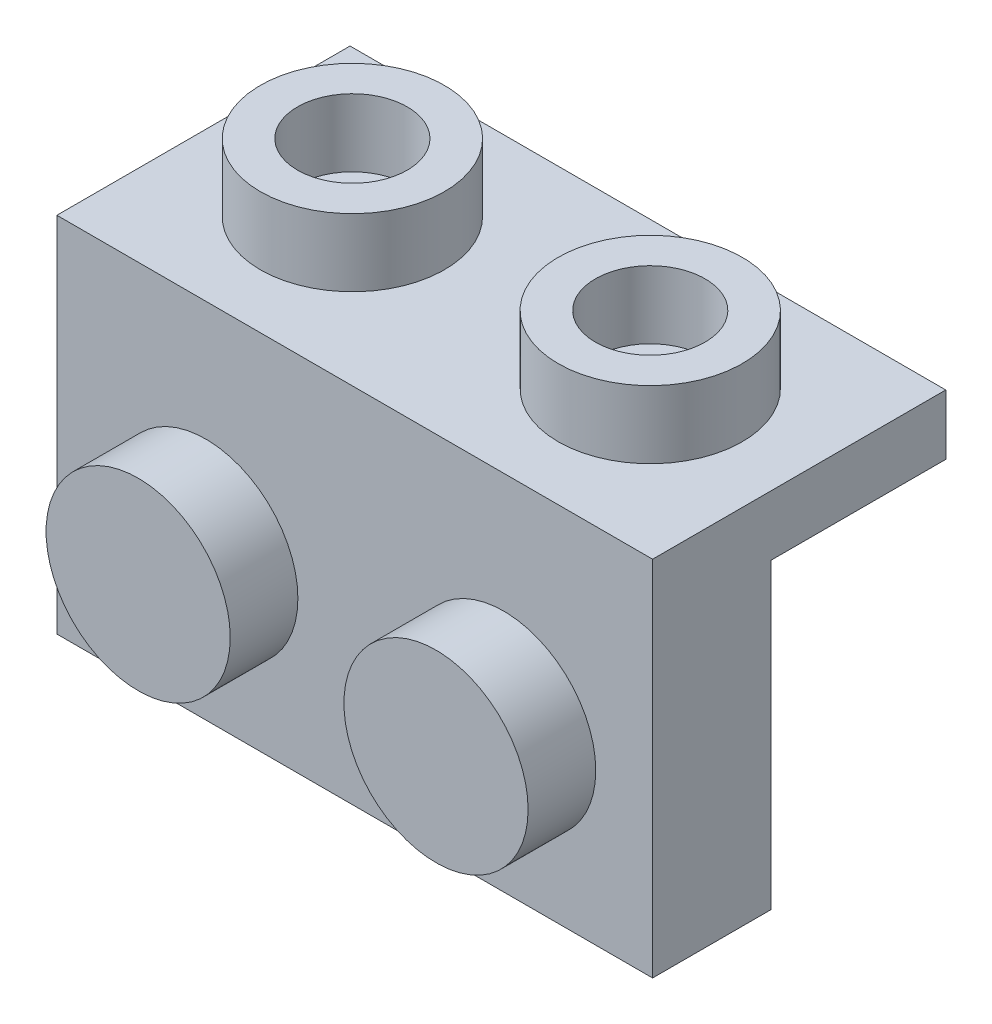
ISO-10303-21;
HEADER;
FILE_DESCRIPTION(('STEP AP214'),'2;1');
FILE_NAME('part.step','',(''),(''),'','','');
FILE_SCHEMA(('AUTOMOTIVE_DESIGN { 1 0 10303 214 1 1 1 1 }'));
ENDSEC;
DATA;
#1=APPLICATION_CONTEXT('core data for automotive mechanical design processes');
#2=APPLICATION_PROTOCOL_DEFINITION('international standard','automotive_design',2000,#1);
#3=PRODUCT_CONTEXT('',#1,'mechanical');
#4=PRODUCT('Part','Part','',(#3));
#5=PRODUCT_RELATED_PRODUCT_CATEGORY('part','',(#4));
#6=PRODUCT_DEFINITION_FORMATION('','',#4);
#7=PRODUCT_DEFINITION_CONTEXT('part definition',#1,'design');
#8=PRODUCT_DEFINITION('design','',#6,#7);
#9=PRODUCT_DEFINITION_SHAPE('','',#8);
#10=(LENGTH_UNIT() NAMED_UNIT(*) SI_UNIT(.MILLI.,.METRE.));
#11=(NAMED_UNIT(*) PLANE_ANGLE_UNIT() SI_UNIT($,.RADIAN.));
#12=(NAMED_UNIT(*) SI_UNIT($,.STERADIAN.) SOLID_ANGLE_UNIT());
#13=UNCERTAINTY_MEASURE_WITH_UNIT(LENGTH_MEASURE(1.E-05),#10,'distance_accuracy_value','');
#14=(GEOMETRIC_REPRESENTATION_CONTEXT(3) GLOBAL_UNCERTAINTY_ASSIGNED_CONTEXT((#13)) GLOBAL_UNIT_ASSIGNED_CONTEXT((#10,
#11,#12)) REPRESENTATION_CONTEXT('',''));
#15=CARTESIAN_POINT('',(0.,0.,0.));
#16=DIRECTION('',(0.,0.,1.));
#17=DIRECTION('',(1.,0.,0.));
#18=AXIS2_PLACEMENT_3D('',#15,#16,#17);
#19=CARTESIAN_POINT('',(-15.85,-9.65,-3.15));
#20=DIRECTION('',(0.,0.,-1.));
#21=DIRECTION('',(-1.,0.,0.));
#22=AXIS2_PLACEMENT_3D('',#19,#20,#21);
#23=PLANE('',#22);
#24=DIRECTION('',(1.,0.,0.));
#25=VECTOR('',#24,1.);
#26=CARTESIAN_POINT('',(-15.85,-8.15,-3.15));
#27=LINE('',#26,#25);
#28=CARTESIAN_POINT('',(-14.35,-8.15,-3.15));
#29=VERTEX_POINT('',#28);
#30=CARTESIAN_POINT('',(-1.5,-8.15,-3.15));
#31=VERTEX_POINT('',#30);
#32=EDGE_CURVE('E245',#29,#31,#27,.T.);
#33=ORIENTED_EDGE('',*,*,#32,.T.);
#34=DIRECTION('',(0.,1.,0.));
#35=VECTOR('',#34,1.);
#36=CARTESIAN_POINT('',(-1.5,0.,-3.15));
#37=LINE('',#36,#35);
#38=CARTESIAN_POINT('',(-1.5,-1.6,-3.15));
#39=VERTEX_POINT('',#38);
#40=EDGE_CURVE('E252',#31,#39,#37,.T.);
#41=ORIENTED_EDGE('',*,*,#40,.T.);
#42=DIRECTION('',(1.,0.,0.));
#43=VECTOR('',#42,1.);
#44=CARTESIAN_POINT('',(-15.85,-1.6,-3.15));
#45=LINE('',#44,#43);
#46=CARTESIAN_POINT('',(0.,-1.6,-3.15));
#47=VERTEX_POINT('',#46);
#48=EDGE_CURVE('E118',#39,#47,#45,.T.);
#49=ORIENTED_EDGE('',*,*,#48,.T.);
#50=DIRECTION('',(0.,1.,0.));
#51=VECTOR('',#50,1.);
#52=CARTESIAN_POINT('',(0.,-9.65,-3.15));
#53=LINE('',#52,#51);
#54=CARTESIAN_POINT('',(0.,-9.65,-3.15));
#55=VERTEX_POINT('',#54);
#56=EDGE_CURVE('E147',#55,#47,#53,.T.);
#57=ORIENTED_EDGE('',*,*,#56,.F.);
#58=DIRECTION('',(1.,0.,0.));
#59=VECTOR('',#58,1.);
#60=CARTESIAN_POINT('',(-15.85,-9.65,-3.15));
#61=LINE('',#60,#59);
#62=CARTESIAN_POINT('',(-15.85,-9.65,-3.15));
#63=VERTEX_POINT('',#62);
#64=EDGE_CURVE('E129',#63,#55,#61,.T.);
#65=ORIENTED_EDGE('',*,*,#64,.F.);
#66=DIRECTION('',(0.,1.,0.));
#67=VECTOR('',#66,1.);
#68=CARTESIAN_POINT('',(-15.85,-9.65,-3.15));
#69=LINE('',#68,#67);
#70=CARTESIAN_POINT('',(-15.85,-1.6,-3.15));
#71=VERTEX_POINT('',#70);
#72=EDGE_CURVE('E123',#63,#71,#69,.T.);
#73=ORIENTED_EDGE('',*,*,#72,.T.);
#74=CARTESIAN_POINT('',(-14.35,-1.6,-3.15));
#75=VERTEX_POINT('',#74);
#76=EDGE_CURVE('E104',#71,#75,#45,.T.);
#77=ORIENTED_EDGE('',*,*,#76,.T.);
#78=DIRECTION('',(0.,1.,0.));
#79=VECTOR('',#78,1.);
#80=CARTESIAN_POINT('',(-14.35,0.,-3.15));
#81=LINE('',#80,#79);
#82=EDGE_CURVE('E246',#29,#75,#81,.T.);
#83=ORIENTED_EDGE('',*,*,#82,.F.);
#84=EDGE_LOOP('',(#33,#41,#49,#57,#65,#73,#77,#83));
#85=FACE_BOUND('',#84,.T.);
#86=ADVANCED_FACE('F33',(#85),#23,.T.);
#87=CARTESIAN_POINT('',(-15.85,0.,-7.8));
#88=DIRECTION('',(0.,1.,0.));
#89=DIRECTION('',(0.,0.,1.));
#90=AXIS2_PLACEMENT_3D('',#87,#88,#89);
#91=PLANE('',#90);
#92=CARTESIAN_POINT('',(-3.9625,0.,-3.9));
#93=DIRECTION('',(0.,1.,0.));
#94=DIRECTION('',(0.,0.,1.));
#95=AXIS2_PLACEMENT_3D('',#92,#93,#94);
#96=CIRCLE('',#95,2.45);
#97=CARTESIAN_POINT('',(-3.9625,0.,-1.45));
#98=VERTEX_POINT('',#97);
#99=EDGE_CURVE('E226',#98,#98,#96,.T.);
#100=ORIENTED_EDGE('',*,*,#99,.F.);
#101=EDGE_LOOP('',(#100));
#102=FACE_BOUND('',#101,.T.);
#103=CARTESIAN_POINT('',(-11.8875,0.,-3.9));
#104=DIRECTION('',(0.,1.,0.));
#105=DIRECTION('',(0.,0.,1.));
#106=AXIS2_PLACEMENT_3D('',#103,#104,#105);
#107=CIRCLE('',#106,2.45);
#108=CARTESIAN_POINT('',(-11.8875,0.,-1.45));
#109=VERTEX_POINT('',#108);
#110=EDGE_CURVE('E217',#109,#109,#107,.T.);
#111=ORIENTED_EDGE('',*,*,#110,.F.);
#112=EDGE_LOOP('',(#111));
#113=FACE_BOUND('',#112,.T.);
#114=DIRECTION('',(0.,0.,1.));
#115=VECTOR('',#114,1.);
#116=CARTESIAN_POINT('',(0.,0.,-7.8));
#117=LINE('',#116,#115);
#118=CARTESIAN_POINT('',(0.,0.,-7.8));
#119=VERTEX_POINT('',#118);
#120=CARTESIAN_POINT('',(0.,0.,0.));
#121=VERTEX_POINT('',#120);
#122=EDGE_CURVE('E137',#119,#121,#117,.T.);
#123=ORIENTED_EDGE('',*,*,#122,.F.);
#124=DIRECTION('',(1.,0.,0.));
#125=VECTOR('',#124,1.);
#126=CARTESIAN_POINT('',(-15.85,0.,-7.8));
#127=LINE('',#126,#125);
#128=CARTESIAN_POINT('',(-15.85,0.,-7.8));
#129=VERTEX_POINT('',#128);
#130=EDGE_CURVE('E57',#129,#119,#127,.T.);
#131=ORIENTED_EDGE('',*,*,#130,.F.);
#132=DIRECTION('',(0.,0.,1.));
#133=VECTOR('',#132,1.);
#134=CARTESIAN_POINT('',(-15.85,0.,-7.8));
#135=LINE('',#134,#133);
#136=CARTESIAN_POINT('',(-15.85,0.,0.));
#137=VERTEX_POINT('',#136);
#138=EDGE_CURVE('E156',#129,#137,#135,.T.);
#139=ORIENTED_EDGE('',*,*,#138,.T.);
#140=DIRECTION('',(1.,0.,0.));
#141=VECTOR('',#140,1.);
#142=CARTESIAN_POINT('',(-15.85,0.,0.));
#143=LINE('',#142,#141);
#144=EDGE_CURVE('E90',#137,#121,#143,.T.);
#145=ORIENTED_EDGE('',*,*,#144,.T.);
#146=EDGE_LOOP('',(#123,#131,#139,#145));
#147=FACE_BOUND('',#146,.T.);
#148=ADVANCED_FACE('F35',(#102,#113,#147),#91,.T.);
#149=CARTESIAN_POINT('',(-15.85,-1.6,-7.8));
#150=DIRECTION('',(0.,0.,-1.));
#151=DIRECTION('',(-1.,0.,0.));
#152=AXIS2_PLACEMENT_3D('',#149,#150,#151);
#153=PLANE('',#152);
#154=DIRECTION('',(0.,1.,0.));
#155=VECTOR('',#154,1.);
#156=CARTESIAN_POINT('',(0.,-1.6,-7.8));
#157=LINE('',#156,#155);
#158=CARTESIAN_POINT('',(0.,-1.6,-7.8));
#159=VERTEX_POINT('',#158);
#160=EDGE_CURVE('E153',#159,#119,#157,.T.);
#161=ORIENTED_EDGE('',*,*,#160,.F.);
#162=DIRECTION('',(1.,0.,0.));
#163=VECTOR('',#162,1.);
#164=CARTESIAN_POINT('',(-15.85,-1.6,-7.8));
#165=LINE('',#164,#163);
#166=CARTESIAN_POINT('',(-15.85,-1.6,-7.8));
#167=VERTEX_POINT('',#166);
#168=EDGE_CURVE('E116',#167,#159,#165,.T.);
#169=ORIENTED_EDGE('',*,*,#168,.F.);
#170=DIRECTION('',(0.,1.,0.));
#171=VECTOR('',#170,1.);
#172=CARTESIAN_POINT('',(-15.85,-1.6,-7.8));
#173=LINE('',#172,#171);
#174=EDGE_CURVE('E125',#167,#129,#173,.T.);
#175=ORIENTED_EDGE('',*,*,#174,.T.);
#176=ORIENTED_EDGE('',*,*,#130,.T.);
#177=EDGE_LOOP('',(#161,#169,#175,#176));
#178=FACE_BOUND('',#177,.T.);
#179=ADVANCED_FACE('F182',(#178),#153,.T.);
#180=CARTESIAN_POINT('',(-15.85,-1.6,-3.15));
#181=DIRECTION('',(0.,-1.,0.));
#182=DIRECTION('',(0.,0.,-1.));
#183=AXIS2_PLACEMENT_3D('',#180,#181,#182);
#184=PLANE('',#183);
#185=DIRECTION('',(0.,0.,-1.));
#186=VECTOR('',#185,1.);
#187=CARTESIAN_POINT('',(0.,-1.6,-3.15));
#188=LINE('',#187,#186);
#189=EDGE_CURVE('E150',#47,#159,#188,.T.);
#190=ORIENTED_EDGE('',*,*,#189,.F.);
#191=ORIENTED_EDGE('',*,*,#48,.F.);
#192=EDGE_CURVE('E112',#75,#39,#45,.T.);
#193=ORIENTED_EDGE('',*,*,#192,.F.);
#194=ORIENTED_EDGE('',*,*,#76,.F.);
#195=DIRECTION('',(0.,0.,-1.));
#196=VECTOR('',#195,1.);
#197=CARTESIAN_POINT('',(-15.85,-1.6,-3.15));
#198=LINE('',#197,#196);
#199=EDGE_CURVE('E108',#71,#167,#198,.T.);
#200=ORIENTED_EDGE('',*,*,#199,.T.);
#201=ORIENTED_EDGE('',*,*,#168,.T.);
#202=EDGE_LOOP('',(#190,#191,#193,#194,#200,#201));
#203=FACE_BOUND('',#202,.T.);
#204=ADVANCED_FACE('F107',(#203),#184,.T.);
#205=CARTESIAN_POINT('',(-15.85,-9.65,0.));
#206=DIRECTION('',(0.,-1.,0.));
#207=DIRECTION('',(0.,0.,-1.));
#208=AXIS2_PLACEMENT_3D('',#205,#206,#207);
#209=PLANE('',#208);
#210=DIRECTION('',(0.,0.,-1.));
#211=VECTOR('',#210,1.);
#212=CARTESIAN_POINT('',(0.,-9.65,0.));
#213=LINE('',#212,#211);
#214=CARTESIAN_POINT('',(0.,-9.65,0.));
#215=VERTEX_POINT('',#214);
#216=EDGE_CURVE('E144',#215,#55,#213,.T.);
#217=ORIENTED_EDGE('',*,*,#216,.F.);
#218=DIRECTION('',(1.,0.,0.));
#219=VECTOR('',#218,1.);
#220=CARTESIAN_POINT('',(-15.85,-9.65,0.));
#221=LINE('',#220,#219);
#222=CARTESIAN_POINT('',(-15.85,-9.65,0.));
#223=VERTEX_POINT('',#222);
#224=EDGE_CURVE('E160',#223,#215,#221,.T.);
#225=ORIENTED_EDGE('',*,*,#224,.F.);
#226=DIRECTION('',(0.,0.,-1.));
#227=VECTOR('',#226,1.);
#228=CARTESIAN_POINT('',(-15.85,-9.65,0.));
#229=LINE('',#228,#227);
#230=EDGE_CURVE('E130',#223,#63,#229,.T.);
#231=ORIENTED_EDGE('',*,*,#230,.T.);
#232=ORIENTED_EDGE('',*,*,#64,.T.);
#233=EDGE_LOOP('',(#217,#225,#231,#232));
#234=FACE_BOUND('',#233,.T.);
#235=ADVANCED_FACE('F195',(#234),#209,.T.);
#236=CARTESIAN_POINT('',(-15.85,0.,0.));
#237=DIRECTION('',(0.,0.,1.));
#238=DIRECTION('',(0.,-1.,0.));
#239=AXIS2_PLACEMENT_3D('',#236,#237,#238);
#240=PLANE('',#239);
#241=CARTESIAN_POINT('',(-3.9625,-5.625,0.));
#242=DIRECTION('',(0.,0.,1.));
#243=DIRECTION('',(1.,0.,0.));
#244=AXIS2_PLACEMENT_3D('',#241,#242,#243);
#245=CIRCLE('',#244,2.45);
#246=CARTESIAN_POINT('',(-1.5125,-5.625,0.));
#247=VERTEX_POINT('',#246);
#248=EDGE_CURVE('E209',#247,#247,#245,.T.);
#249=ORIENTED_EDGE('',*,*,#248,.F.);
#250=EDGE_LOOP('',(#249));
#251=FACE_BOUND('',#250,.T.);
#252=CARTESIAN_POINT('',(-11.8875,-5.625,0.));
#253=DIRECTION('',(0.,0.,1.));
#254=DIRECTION('',(1.,0.,0.));
#255=AXIS2_PLACEMENT_3D('',#252,#253,#254);
#256=CIRCLE('',#255,2.45);
#257=CARTESIAN_POINT('',(-9.4375,-5.625,0.));
#258=VERTEX_POINT('',#257);
#259=EDGE_CURVE('E212',#258,#258,#256,.T.);
#260=ORIENTED_EDGE('',*,*,#259,.F.);
#261=EDGE_LOOP('',(#260));
#262=FACE_BOUND('',#261,.T.);
#263=DIRECTION('',(0.,-1.,0.));
#264=VECTOR('',#263,1.);
#265=CARTESIAN_POINT('',(0.,0.,0.));
#266=LINE('',#265,#264);
#267=EDGE_CURVE('E140',#121,#215,#266,.T.);
#268=ORIENTED_EDGE('',*,*,#267,.F.);
#269=ORIENTED_EDGE('',*,*,#144,.F.);
#270=DIRECTION('',(0.,-1.,0.));
#271=VECTOR('',#270,1.);
#272=CARTESIAN_POINT('',(-15.85,0.,0.));
#273=LINE('',#272,#271);
#274=EDGE_CURVE('E132',#137,#223,#273,.T.);
#275=ORIENTED_EDGE('',*,*,#274,.T.);
#276=ORIENTED_EDGE('',*,*,#224,.T.);
#277=EDGE_LOOP('',(#268,#269,#275,#276));
#278=FACE_BOUND('',#277,.T.);
#279=ADVANCED_FACE('F197',(#251,#262,#278),#240,.T.);
#280=CARTESIAN_POINT('',(-15.85,0.,0.));
#281=DIRECTION('',(1.,0.,0.));
#282=DIRECTION('',(0.,0.,-1.));
#283=AXIS2_PLACEMENT_3D('',#280,#281,#282);
#284=PLANE('',#283);
#285=ORIENTED_EDGE('',*,*,#138,.F.);
#286=ORIENTED_EDGE('',*,*,#174,.F.);
#287=ORIENTED_EDGE('',*,*,#199,.F.);
#288=ORIENTED_EDGE('',*,*,#72,.F.);
#289=ORIENTED_EDGE('',*,*,#230,.F.);
#290=ORIENTED_EDGE('',*,*,#274,.F.);
#291=EDGE_LOOP('',(#285,#286,#287,#288,#289,#290));
#292=FACE_BOUND('',#291,.T.);
#293=ADVANCED_FACE('F121',(#292),#284,.F.);
#294=CARTESIAN_POINT('',(0.,0.,0.));
#295=DIRECTION('',(1.,0.,0.));
#296=DIRECTION('',(0.,0.,-1.));
#297=AXIS2_PLACEMENT_3D('',#294,#295,#296);
#298=PLANE('',#297);
#299=ORIENTED_EDGE('',*,*,#122,.T.);
#300=ORIENTED_EDGE('',*,*,#267,.T.);
#301=ORIENTED_EDGE('',*,*,#216,.T.);
#302=ORIENTED_EDGE('',*,*,#56,.T.);
#303=ORIENTED_EDGE('',*,*,#189,.T.);
#304=ORIENTED_EDGE('',*,*,#160,.T.);
#305=EDGE_LOOP('',(#299,#300,#301,#302,#303,#304));
#306=FACE_BOUND('',#305,.T.);
#307=ADVANCED_FACE('F204',(#306),#298,.T.);
#308=CARTESIAN_POINT('',(-11.8875,1.8,-3.9));
#309=DIRECTION('',(0.,1.,0.));
#310=DIRECTION('',(0.,0.,1.));
#311=AXIS2_PLACEMENT_3D('',#308,#309,#310);
#312=PLANE('',#311);
#313=CARTESIAN_POINT('',(-11.8875,1.8,-3.9));
#314=DIRECTION('',(0.,1.,0.));
#315=DIRECTION('',(0.,0.,1.));
#316=AXIS2_PLACEMENT_3D('',#313,#314,#315);
#317=CIRCLE('',#316,2.45);
#318=CARTESIAN_POINT('',(-11.8875,1.8,-1.45));
#319=VERTEX_POINT('',#318);
#320=EDGE_CURVE('E141',#319,#319,#317,.T.);
#321=ORIENTED_EDGE('',*,*,#320,.T.);
#322=EDGE_LOOP('',(#321));
#323=FACE_BOUND('',#322,.T.);
#324=CARTESIAN_POINT('',(-11.8875,1.8,-3.9));
#325=DIRECTION('',(0.,1.,0.));
#326=DIRECTION('',(0.,0.,1.));
#327=AXIS2_PLACEMENT_3D('',#324,#325,#326);
#328=CIRCLE('',#327,1.46);
#329=CARTESIAN_POINT('',(-11.8875,1.8,-2.44));
#330=VERTEX_POINT('',#329);
#331=EDGE_CURVE('E220',#330,#330,#328,.T.);
#332=ORIENTED_EDGE('',*,*,#331,.F.);
#333=EDGE_LOOP('',(#332));
#334=FACE_BOUND('',#333,.T.);
#335=ADVANCED_FACE('F378',(#323,#334),#312,.T.);
#336=CARTESIAN_POINT('',(-11.8875,1.8,-3.9));
#337=DIRECTION('',(0.,-1.,0.));
#338=DIRECTION('',(0.,0.,-1.));
#339=AXIS2_PLACEMENT_3D('',#336,#337,#338);
#340=CYLINDRICAL_SURFACE('',#339,2.45);
#341=ORIENTED_EDGE('',*,*,#320,.F.);
#342=EDGE_LOOP('',(#341));
#343=FACE_BOUND('',#342,.T.);
#344=ORIENTED_EDGE('',*,*,#110,.T.);
#345=EDGE_LOOP('',(#344));
#346=FACE_BOUND('',#345,.T.);
#347=ADVANCED_FACE('F178',(#343,#346),#340,.T.);
#348=CARTESIAN_POINT('',(-11.8875,1.8,-3.9));
#349=DIRECTION('',(0.,-1.,0.));
#350=DIRECTION('',(0.,0.,-1.));
#351=AXIS2_PLACEMENT_3D('',#348,#349,#350);
#352=CYLINDRICAL_SURFACE('',#351,1.46);
#353=ORIENTED_EDGE('',*,*,#331,.T.);
#354=EDGE_LOOP('',(#353));
#355=FACE_BOUND('',#354,.T.);
#356=CARTESIAN_POINT('',(-11.8875,0.,-3.9));
#357=DIRECTION('',(0.,1.,0.));
#358=DIRECTION('',(0.,0.,1.));
#359=AXIS2_PLACEMENT_3D('',#356,#357,#358);
#360=CIRCLE('',#359,1.46);
#361=CARTESIAN_POINT('',(-11.8875,0.,-2.44));
#362=VERTEX_POINT('',#361);
#363=EDGE_CURVE('E41',#362,#362,#360,.F.);
#364=ORIENTED_EDGE('',*,*,#363,.T.);
#365=EDGE_LOOP('',(#364));
#366=FACE_BOUND('',#365,.T.);
#367=ADVANCED_FACE('F165',(#355,#366),#352,.F.);
#368=ORIENTED_EDGE('',*,*,#363,.F.);
#369=EDGE_LOOP('',(#368));
#370=FACE_BOUND('',#369,.T.);
#371=ADVANCED_FACE('F167',(#370),#91,.T.);
#372=CARTESIAN_POINT('',(-3.9625,1.8,-3.9));
#373=DIRECTION('',(0.,1.,0.));
#374=DIRECTION('',(0.,0.,1.));
#375=AXIS2_PLACEMENT_3D('',#372,#373,#374);
#376=PLANE('',#375);
#377=CARTESIAN_POINT('',(-3.9625,1.8,-3.9));
#378=DIRECTION('',(0.,1.,0.));
#379=DIRECTION('',(0.,0.,1.));
#380=AXIS2_PLACEMENT_3D('',#377,#378,#379);
#381=CIRCLE('',#380,2.45);
#382=CARTESIAN_POINT('',(-3.9625,1.8,-1.45));
#383=VERTEX_POINT('',#382);
#384=EDGE_CURVE('E225',#383,#383,#381,.T.);
#385=ORIENTED_EDGE('',*,*,#384,.T.);
#386=EDGE_LOOP('',(#385));
#387=FACE_BOUND('',#386,.T.);
#388=CARTESIAN_POINT('',(-3.9625,1.8,-3.9));
#389=DIRECTION('',(0.,1.,0.));
#390=DIRECTION('',(0.,0.,1.));
#391=AXIS2_PLACEMENT_3D('',#388,#389,#390);
#392=CIRCLE('',#391,1.46);
#393=CARTESIAN_POINT('',(-3.9625,1.8,-2.44));
#394=VERTEX_POINT('',#393);
#395=EDGE_CURVE('E229',#394,#394,#392,.T.);
#396=ORIENTED_EDGE('',*,*,#395,.F.);
#397=EDGE_LOOP('',(#396));
#398=FACE_BOUND('',#397,.T.);
#399=ADVANCED_FACE('F169',(#387,#398),#376,.T.);
#400=CARTESIAN_POINT('',(-3.9625,1.8,-3.9));
#401=DIRECTION('',(0.,-1.,0.));
#402=DIRECTION('',(0.,0.,-1.));
#403=AXIS2_PLACEMENT_3D('',#400,#401,#402);
#404=CYLINDRICAL_SURFACE('',#403,2.45);
#405=ORIENTED_EDGE('',*,*,#384,.F.);
#406=EDGE_LOOP('',(#405));
#407=FACE_BOUND('',#406,.T.);
#408=ORIENTED_EDGE('',*,*,#99,.T.);
#409=EDGE_LOOP('',(#408));
#410=FACE_BOUND('',#409,.T.);
#411=ADVANCED_FACE('F175',(#407,#410),#404,.T.);
#412=CARTESIAN_POINT('',(-3.9625,1.8,-3.9));
#413=DIRECTION('',(0.,-1.,0.));
#414=DIRECTION('',(0.,0.,-1.));
#415=AXIS2_PLACEMENT_3D('',#412,#413,#414);
#416=CYLINDRICAL_SURFACE('',#415,1.46);
#417=ORIENTED_EDGE('',*,*,#395,.T.);
#418=EDGE_LOOP('',(#417));
#419=FACE_BOUND('',#418,.T.);
#420=CARTESIAN_POINT('',(-3.9625,0.,-3.9));
#421=DIRECTION('',(0.,1.,0.));
#422=DIRECTION('',(0.,0.,1.));
#423=AXIS2_PLACEMENT_3D('',#420,#421,#422);
#424=CIRCLE('',#423,1.46);
#425=CARTESIAN_POINT('',(-3.9625,0.,-2.44));
#426=VERTEX_POINT('',#425);
#427=EDGE_CURVE('E11',#426,#426,#424,.F.);
#428=ORIENTED_EDGE('',*,*,#427,.T.);
#429=EDGE_LOOP('',(#428));
#430=FACE_BOUND('',#429,.T.);
#431=ADVANCED_FACE('F186',(#419,#430),#416,.F.);
#432=ORIENTED_EDGE('',*,*,#427,.F.);
#433=EDGE_LOOP('',(#432));
#434=FACE_BOUND('',#433,.T.);
#435=ADVANCED_FACE('F170',(#434),#91,.T.);
#436=CARTESIAN_POINT('',(-11.8875,-5.625,1.8));
#437=DIRECTION('',(0.,0.,-1.));
#438=DIRECTION('',(-1.,0.,0.));
#439=AXIS2_PLACEMENT_3D('',#436,#437,#438);
#440=CYLINDRICAL_SURFACE('',#439,2.45);
#441=CARTESIAN_POINT('',(-11.8875,-5.625,1.8));
#442=DIRECTION('',(0.,0.,1.));
#443=DIRECTION('',(1.,0.,0.));
#444=AXIS2_PLACEMENT_3D('',#441,#442,#443);
#445=CIRCLE('',#444,2.45);
#446=CARTESIAN_POINT('',(-9.4375,-5.625,1.8));
#447=VERTEX_POINT('',#446);
#448=EDGE_CURVE('E234',#447,#447,#445,.T.);
#449=ORIENTED_EDGE('',*,*,#448,.F.);
#450=EDGE_LOOP('',(#449));
#451=FACE_BOUND('',#450,.T.);
#452=ORIENTED_EDGE('',*,*,#259,.T.);
#453=EDGE_LOOP('',(#452));
#454=FACE_BOUND('',#453,.T.);
#455=ADVANCED_FACE('F185',(#451,#454),#440,.T.);
#456=CARTESIAN_POINT('',(-11.8875,-5.625,1.8));
#457=DIRECTION('',(0.,0.,1.));
#458=DIRECTION('',(1.,0.,0.));
#459=AXIS2_PLACEMENT_3D('',#456,#457,#458);
#460=PLANE('',#459);
#461=ORIENTED_EDGE('',*,*,#448,.T.);
#462=EDGE_LOOP('',(#461));
#463=FACE_BOUND('',#462,.T.);
#464=ADVANCED_FACE('F364',(#463),#460,.T.);
#465=CARTESIAN_POINT('',(-3.9625,-5.625,1.8));
#466=DIRECTION('',(0.,0.,-1.));
#467=DIRECTION('',(-1.,0.,0.));
#468=AXIS2_PLACEMENT_3D('',#465,#466,#467);
#469=CYLINDRICAL_SURFACE('',#468,2.45);
#470=CARTESIAN_POINT('',(-3.9625,-5.625,1.8));
#471=DIRECTION('',(0.,0.,1.));
#472=DIRECTION('',(1.,0.,0.));
#473=AXIS2_PLACEMENT_3D('',#470,#471,#472);
#474=CIRCLE('',#473,2.45);
#475=CARTESIAN_POINT('',(-1.5125,-5.625,1.8));
#476=VERTEX_POINT('',#475);
#477=EDGE_CURVE('E236',#476,#476,#474,.T.);
#478=ORIENTED_EDGE('',*,*,#477,.F.);
#479=EDGE_LOOP('',(#478));
#480=FACE_BOUND('',#479,.T.);
#481=ORIENTED_EDGE('',*,*,#248,.T.);
#482=EDGE_LOOP('',(#481));
#483=FACE_BOUND('',#482,.T.);
#484=ADVANCED_FACE('F333',(#480,#483),#469,.T.);
#485=CARTESIAN_POINT('',(-3.9625,-5.625,1.8));
#486=DIRECTION('',(0.,0.,1.));
#487=DIRECTION('',(1.,0.,0.));
#488=AXIS2_PLACEMENT_3D('',#485,#486,#487);
#489=PLANE('',#488);
#490=ORIENTED_EDGE('',*,*,#477,.T.);
#491=EDGE_LOOP('',(#490));
#492=FACE_BOUND('',#491,.T.);
#493=ADVANCED_FACE('F326',(#492),#489,.T.);
#494=CARTESIAN_POINT('',(-15.85,-9.65,-3.15));
#495=DIRECTION('',(0.,0.,-1.));
#496=DIRECTION('',(-1.,0.,0.));
#497=AXIS2_PLACEMENT_3D('',#494,#495,#496);
#498=PLANE('',#497);
#499=ORIENTED_EDGE('',*,*,#192,.T.);
#500=CARTESIAN_POINT('',(-1.5,-1.5,-3.15));
#501=VERTEX_POINT('',#500);
#502=EDGE_CURVE('E256',#39,#501,#37,.T.);
#503=ORIENTED_EDGE('',*,*,#502,.T.);
#504=DIRECTION('',(-1.,0.,0.));
#505=VECTOR('',#504,1.);
#506=CARTESIAN_POINT('',(-15.85,-1.5,-3.15));
#507=LINE('',#506,#505);
#508=CARTESIAN_POINT('',(-14.35,-1.5,-3.15));
#509=VERTEX_POINT('',#508);
#510=EDGE_CURVE('E240',#501,#509,#507,.T.);
#511=ORIENTED_EDGE('',*,*,#510,.T.);
#512=EDGE_CURVE('E249',#75,#509,#81,.T.);
#513=ORIENTED_EDGE('',*,*,#512,.F.);
#514=EDGE_LOOP('',(#499,#503,#511,#513));
#515=FACE_BOUND('',#514,.T.);
#516=ADVANCED_FACE('F324',(#515),#498,.F.);
#517=CARTESIAN_POINT('',(-15.85,-1.5,-7.8));
#518=DIRECTION('',(0.,1.,0.));
#519=DIRECTION('',(0.,0.,1.));
#520=AXIS2_PLACEMENT_3D('',#517,#518,#519);
#521=PLANE('',#520);
#522=DIRECTION('',(1.,0.,0.));
#523=VECTOR('',#522,1.);
#524=CARTESIAN_POINT('',(-15.85,-1.5,-1.5));
#525=LINE('',#524,#523);
#526=CARTESIAN_POINT('',(-14.35,-1.5,-1.5));
#527=VERTEX_POINT('',#526);
#528=CARTESIAN_POINT('',(-1.5,-1.5,-1.5));
#529=VERTEX_POINT('',#528);
#530=EDGE_CURVE('E248',#527,#529,#525,.T.);
#531=ORIENTED_EDGE('',*,*,#530,.F.);
#532=DIRECTION('',(0.,0.,1.));
#533=VECTOR('',#532,1.);
#534=CARTESIAN_POINT('',(-14.35,-1.5,0.));
#535=LINE('',#534,#533);
#536=EDGE_CURVE('E255',#509,#527,#535,.T.);
#537=ORIENTED_EDGE('',*,*,#536,.F.);
#538=ORIENTED_EDGE('',*,*,#510,.F.);
#539=DIRECTION('',(0.,0.,1.));
#540=VECTOR('',#539,1.);
#541=CARTESIAN_POINT('',(-1.5,-1.5,0.));
#542=LINE('',#541,#540);
#543=EDGE_CURVE('E265',#501,#529,#542,.T.);
#544=ORIENTED_EDGE('',*,*,#543,.T.);
#545=EDGE_LOOP('',(#531,#537,#538,#544));
#546=FACE_BOUND('',#545,.T.);
#547=ADVANCED_FACE('F291',(#546),#521,.F.);
#548=CARTESIAN_POINT('',(-15.85,-8.15,0.));
#549=DIRECTION('',(0.,-1.,0.));
#550=DIRECTION('',(0.,0.,-1.));
#551=AXIS2_PLACEMENT_3D('',#548,#549,#550);
#552=PLANE('',#551);
#553=DIRECTION('',(0.,0.,-1.));
#554=VECTOR('',#553,1.);
#555=CARTESIAN_POINT('',(-1.5,-8.15,0.));
#556=LINE('',#555,#554);
#557=CARTESIAN_POINT('',(-1.5,-8.15,-1.5));
#558=VERTEX_POINT('',#557);
#559=EDGE_CURVE('E269',#558,#31,#556,.T.);
#560=ORIENTED_EDGE('',*,*,#559,.T.);
#561=ORIENTED_EDGE('',*,*,#32,.F.);
#562=DIRECTION('',(0.,0.,-1.));
#563=VECTOR('',#562,1.);
#564=CARTESIAN_POINT('',(-14.35,-8.15,0.));
#565=LINE('',#564,#563);
#566=CARTESIAN_POINT('',(-14.35,-8.15,-1.5));
#567=VERTEX_POINT('',#566);
#568=EDGE_CURVE('E48',#567,#29,#565,.T.);
#569=ORIENTED_EDGE('',*,*,#568,.F.);
#570=DIRECTION('',(1.,0.,0.));
#571=VECTOR('',#570,1.);
#572=CARTESIAN_POINT('',(-15.85,-8.15,-1.5));
#573=LINE('',#572,#571);
#574=EDGE_CURVE('E251',#567,#558,#573,.T.);
#575=ORIENTED_EDGE('',*,*,#574,.T.);
#576=EDGE_LOOP('',(#560,#561,#569,#575));
#577=FACE_BOUND('',#576,.T.);
#578=ADVANCED_FACE('F310',(#577),#552,.F.);
#579=CARTESIAN_POINT('',(-15.85,0.,-1.5));
#580=DIRECTION('',(0.,0.,1.));
#581=DIRECTION('',(0.,-1.,0.));
#582=AXIS2_PLACEMENT_3D('',#579,#580,#581);
#583=PLANE('',#582);
#584=CARTESIAN_POINT('',(-3.9625,-5.625,-1.5));
#585=DIRECTION('',(0.,0.,1.));
#586=DIRECTION('',(0.,-1.,0.));
#587=AXIS2_PLACEMENT_3D('',#584,#585,#586);
#588=CIRCLE('',#587,0.95);
#589=CARTESIAN_POINT('',(-3.9625,-6.575,-1.5));
#590=VERTEX_POINT('',#589);
#591=EDGE_CURVE('E261',#590,#590,#588,.T.);
#592=ORIENTED_EDGE('',*,*,#591,.T.);
#593=EDGE_LOOP('',(#592));
#594=FACE_BOUND('',#593,.T.);
#595=CARTESIAN_POINT('',(-11.8875,-5.625,-1.5));
#596=DIRECTION('',(0.,0.,1.));
#597=DIRECTION('',(0.,-1.,0.));
#598=AXIS2_PLACEMENT_3D('',#595,#596,#597);
#599=CIRCLE('',#598,0.950000000000002);
#600=CARTESIAN_POINT('',(-11.8875,-6.575,-1.5));
#601=VERTEX_POINT('',#600);
#602=EDGE_CURVE('E260',#601,#601,#599,.T.);
#603=ORIENTED_EDGE('',*,*,#602,.T.);
#604=EDGE_LOOP('',(#603));
#605=FACE_BOUND('',#604,.T.);
#606=DIRECTION('',(0.,-1.,0.));
#607=VECTOR('',#606,1.);
#608=CARTESIAN_POINT('',(-1.5,0.,-1.5));
#609=LINE('',#608,#607);
#610=EDGE_CURVE('E266',#529,#558,#609,.T.);
#611=ORIENTED_EDGE('',*,*,#610,.T.);
#612=ORIENTED_EDGE('',*,*,#574,.F.);
#613=DIRECTION('',(0.,-1.,0.));
#614=VECTOR('',#613,1.);
#615=CARTESIAN_POINT('',(-14.35,0.,-1.5));
#616=LINE('',#615,#614);
#617=EDGE_CURVE('E278',#527,#567,#616,.T.);
#618=ORIENTED_EDGE('',*,*,#617,.F.);
#619=ORIENTED_EDGE('',*,*,#530,.T.);
#620=EDGE_LOOP('',(#611,#612,#618,#619));
#621=FACE_BOUND('',#620,.T.);
#622=ADVANCED_FACE('F302',(#594,#605,#621),#583,.F.);
#623=CARTESIAN_POINT('',(-14.35,0.,0.));
#624=DIRECTION('',(1.,0.,0.));
#625=DIRECTION('',(0.,0.,-1.));
#626=AXIS2_PLACEMENT_3D('',#623,#624,#625);
#627=PLANE('',#626);
#628=ORIENTED_EDGE('',*,*,#536,.T.);
#629=ORIENTED_EDGE('',*,*,#617,.T.);
#630=ORIENTED_EDGE('',*,*,#568,.T.);
#631=ORIENTED_EDGE('',*,*,#82,.T.);
#632=ORIENTED_EDGE('',*,*,#512,.T.);
#633=EDGE_LOOP('',(#628,#629,#630,#631,#632));
#634=FACE_BOUND('',#633,.T.);
#635=ADVANCED_FACE('F314',(#634),#627,.T.);
#636=CARTESIAN_POINT('',(-1.5,0.,0.));
#637=DIRECTION('',(1.,0.,0.));
#638=DIRECTION('',(0.,0.,-1.));
#639=AXIS2_PLACEMENT_3D('',#636,#637,#638);
#640=PLANE('',#639);
#641=ORIENTED_EDGE('',*,*,#40,.F.);
#642=ORIENTED_EDGE('',*,*,#559,.F.);
#643=ORIENTED_EDGE('',*,*,#610,.F.);
#644=ORIENTED_EDGE('',*,*,#543,.F.);
#645=ORIENTED_EDGE('',*,*,#502,.F.);
#646=EDGE_LOOP('',(#641,#642,#643,#644,#645));
#647=FACE_BOUND('',#646,.T.);
#648=ADVANCED_FACE('F306',(#647),#640,.F.);
#649=CARTESIAN_POINT('',(-11.8875,-5.625,1.8));
#650=DIRECTION('',(0.,0.,-1.));
#651=DIRECTION('',(-1.,0.,0.));
#652=AXIS2_PLACEMENT_3D('',#649,#650,#651);
#653=CYLINDRICAL_SURFACE('',#652,0.950000000000002);
#654=CARTESIAN_POINT('',(-11.8875,-5.625,0.3));
#655=DIRECTION('',(0.,0.,1.));
#656=DIRECTION('',(1.,0.,0.));
#657=AXIS2_PLACEMENT_3D('',#654,#655,#656);
#658=CIRCLE('',#657,0.950000000000002);
#659=CARTESIAN_POINT('',(-10.9375,-5.625,0.3));
#660=VERTEX_POINT('',#659);
#661=EDGE_CURVE('E262',#660,#660,#658,.T.);
#662=ORIENTED_EDGE('',*,*,#661,.T.);
#663=EDGE_LOOP('',(#662));
#664=FACE_BOUND('',#663,.T.);
#665=ORIENTED_EDGE('',*,*,#602,.F.);
#666=EDGE_LOOP('',(#665));
#667=FACE_BOUND('',#666,.T.);
#668=ADVANCED_FACE('F346',(#664,#667),#653,.F.);
#669=CARTESIAN_POINT('',(-11.8875,-5.625,0.3));
#670=DIRECTION('',(0.,0.,1.));
#671=DIRECTION('',(1.,0.,0.));
#672=AXIS2_PLACEMENT_3D('',#669,#670,#671);
#673=PLANE('',#672);
#674=ORIENTED_EDGE('',*,*,#661,.F.);
#675=EDGE_LOOP('',(#674));
#676=FACE_BOUND('',#675,.T.);
#677=ADVANCED_FACE('F349',(#676),#673,.F.);
#678=CARTESIAN_POINT('',(-3.9625,-5.625,1.8));
#679=DIRECTION('',(0.,0.,-1.));
#680=DIRECTION('',(-1.,0.,0.));
#681=AXIS2_PLACEMENT_3D('',#678,#679,#680);
#682=CYLINDRICAL_SURFACE('',#681,0.95);
#683=CARTESIAN_POINT('',(-3.9625,-5.625,0.3));
#684=DIRECTION('',(0.,0.,1.));
#685=DIRECTION('',(1.,0.,0.));
#686=AXIS2_PLACEMENT_3D('',#683,#684,#685);
#687=CIRCLE('',#686,0.95);
#688=CARTESIAN_POINT('',(-3.0125,-5.625,0.3));
#689=VERTEX_POINT('',#688);
#690=EDGE_CURVE('E257',#689,#689,#687,.T.);
#691=ORIENTED_EDGE('',*,*,#690,.T.);
#692=EDGE_LOOP('',(#691));
#693=FACE_BOUND('',#692,.T.);
#694=ORIENTED_EDGE('',*,*,#591,.F.);
#695=EDGE_LOOP('',(#694));
#696=FACE_BOUND('',#695,.T.);
#697=ADVANCED_FACE('F353',(#693,#696),#682,.F.);
#698=CARTESIAN_POINT('',(-3.9625,-5.625,0.3));
#699=DIRECTION('',(0.,0.,1.));
#700=DIRECTION('',(1.,0.,0.));
#701=AXIS2_PLACEMENT_3D('',#698,#699,#700);
#702=PLANE('',#701);
#703=ORIENTED_EDGE('',*,*,#690,.F.);
#704=EDGE_LOOP('',(#703));
#705=FACE_BOUND('',#704,.T.);
#706=ADVANCED_FACE('F357',(#705),#702,.F.);
#707=CLOSED_SHELL('',(#86,#148,#179,#204,#235,#279,#293,#307,#335,#347,#367,#371,#399,#411,#431,
#435,#455,#464,#484,#493,#516,#547,#578,#622,#635,#648,#668,#677,#697,#706));
#708=MANIFOLD_SOLID_BREP('B2',#707);
#709=ADVANCED_BREP_SHAPE_REPRESENTATION('',(#18,#708),#14);
#710=SHAPE_DEFINITION_REPRESENTATION(#9,#709);
ENDSEC;
END-ISO-10303-21;
